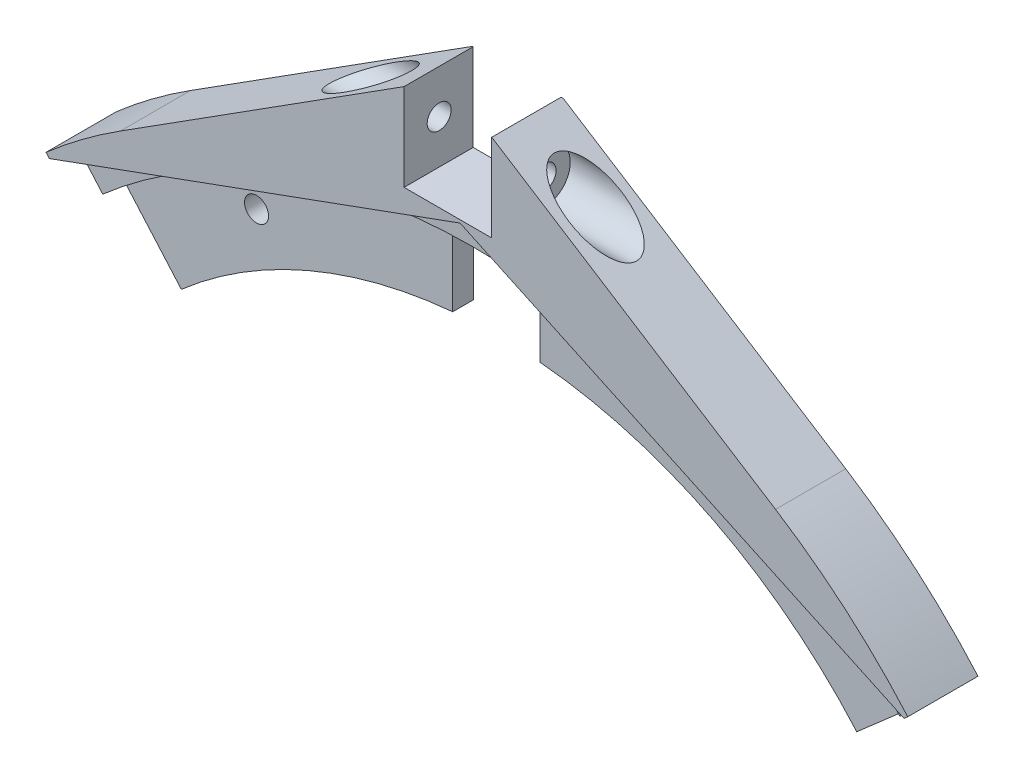
ISO-10303-21;
HEADER;
FILE_DESCRIPTION(('STEP AP214'),'2;1');
FILE_NAME('part.step','',(''),(''),'','','');
FILE_SCHEMA(('AUTOMOTIVE_DESIGN { 1 0 10303 214 1 1 1 1 }'));
ENDSEC;
DATA;
#1=APPLICATION_CONTEXT('core data for automotive mechanical design processes');
#2=APPLICATION_PROTOCOL_DEFINITION('international standard','automotive_design',2000,#1);
#3=PRODUCT_CONTEXT('',#1,'mechanical');
#4=PRODUCT('Part','Part','',(#3));
#5=PRODUCT_RELATED_PRODUCT_CATEGORY('part','',(#4));
#6=PRODUCT_DEFINITION_FORMATION('','',#4);
#7=PRODUCT_DEFINITION_CONTEXT('part definition',#1,'design');
#8=PRODUCT_DEFINITION('design','',#6,#7);
#9=PRODUCT_DEFINITION_SHAPE('','',#8);
#10=(LENGTH_UNIT() NAMED_UNIT(*) SI_UNIT(.MILLI.,.METRE.));
#11=(NAMED_UNIT(*) PLANE_ANGLE_UNIT() SI_UNIT($,.RADIAN.));
#12=(NAMED_UNIT(*) SI_UNIT($,.STERADIAN.) SOLID_ANGLE_UNIT());
#13=UNCERTAINTY_MEASURE_WITH_UNIT(LENGTH_MEASURE(1.E-05),#10,'distance_accuracy_value','');
#14=(GEOMETRIC_REPRESENTATION_CONTEXT(3) GLOBAL_UNCERTAINTY_ASSIGNED_CONTEXT((#13)) GLOBAL_UNIT_ASSIGNED_CONTEXT((#10,
#11,#12)) REPRESENTATION_CONTEXT('',''));
#15=CARTESIAN_POINT('',(0.,0.,0.));
#16=DIRECTION('',(0.,0.,1.));
#17=DIRECTION('',(1.,0.,0.));
#18=AXIS2_PLACEMENT_3D('',#15,#16,#17);
#19=CARTESIAN_POINT('',(-92.128353130934,149.5,-1.95000000000001));
#20=DIRECTION('',(1.,0.,0.));
#21=DIRECTION('',(0.,1.,0.));
#22=AXIS2_PLACEMENT_3D('',#19,#20,#21);
#23=CYLINDRICAL_SURFACE('',#22,2.75);
#24=CARTESIAN_POINT('',(10.05,149.5,-1.95000000000001));
#25=DIRECTION('',(1.,0.,0.));
#26=DIRECTION('',(0.,1.,0.));
#27=AXIS2_PLACEMENT_3D('',#24,#25,#26);
#28=CIRCLE('',#27,2.75);
#29=CARTESIAN_POINT('',(10.05,152.25,-1.95000000000001));
#30=VERTEX_POINT('',#29);
#31=EDGE_CURVE('E253',#30,#30,#28,.T.);
#32=ORIENTED_EDGE('',*,*,#31,.F.);
#33=EDGE_LOOP('',(#32));
#34=FACE_BOUND('',#33,.T.);
#35=CARTESIAN_POINT('',(14.,149.5,-1.95000000000001));
#36=DIRECTION('',(1.,0.,0.));
#37=DIRECTION('',(0.,0.,-1.));
#38=AXIS2_PLACEMENT_3D('',#35,#36,#37);
#39=CIRCLE('',#38,2.75);
#40=CARTESIAN_POINT('',(14.,149.5,-4.70000000000001));
#41=VERTEX_POINT('',#40);
#42=EDGE_CURVE('E410',#41,#41,#39,.F.);
#43=ORIENTED_EDGE('',*,*,#42,.F.);
#44=EDGE_LOOP('',(#43));
#45=FACE_BOUND('',#44,.T.);
#46=ADVANCED_FACE('F45',(#34,#45),#23,.F.);
#47=CARTESIAN_POINT('',(0.,0.,6.1));
#48=DIRECTION('',(0.,0.,-1.));
#49=DIRECTION('',(-1.,0.,0.));
#50=AXIS2_PLACEMENT_3D('',#47,#48,#49);
#51=CYLINDRICAL_SURFACE('',#50,140.);
#52=DIRECTION('',(0.,0.,-1.));
#53=VECTOR('',#52,1.);
#54=CARTESIAN_POINT('',(75.1006903670099,118.15196276998,83.1795206264264));
#55=LINE('',#54,#53);
#56=CARTESIAN_POINT('',(75.1006903670099,118.15196276998,6.09999999999999));
#57=VERTEX_POINT('',#56);
#58=CARTESIAN_POINT('',(75.1006903670099,118.15196276998,-10.));
#59=VERTEX_POINT('',#58);
#60=EDGE_CURVE('E269',#57,#59,#55,.T.);
#61=ORIENTED_EDGE('',*,*,#60,.F.);
#62=CARTESIAN_POINT('',(0.,0.,6.1));
#63=DIRECTION('',(0.,0.,1.));
#64=DIRECTION('',(1.,0.,0.));
#65=AXIS2_PLACEMENT_3D('',#62,#63,#64);
#66=CIRCLE('',#65,140.);
#67=CARTESIAN_POINT('',(105.415210237339,92.1283531309317,6.1));
#68=VERTEX_POINT('',#67);
#69=EDGE_CURVE('E377',#68,#57,#66,.T.);
#70=ORIENTED_EDGE('',*,*,#69,.F.);
#71=DIRECTION('',(0.,0.,-1.));
#72=VECTOR('',#71,1.);
#73=CARTESIAN_POINT('',(105.415210237339,92.1283531309317,6.1));
#74=LINE('',#73,#72);
#75=CARTESIAN_POINT('',(105.41521023734,92.1283531309322,-10.));
#76=VERTEX_POINT('',#75);
#77=EDGE_CURVE('E402',#68,#76,#74,.T.);
#78=ORIENTED_EDGE('',*,*,#77,.T.);
#79=CARTESIAN_POINT('',(0.,0.,-10.));
#80=DIRECTION('',(0.,0.,-1.));
#81=DIRECTION('',(-1.,0.,0.));
#82=AXIS2_PLACEMENT_3D('',#79,#80,#81);
#83=CIRCLE('',#82,140.000000000001);
#84=EDGE_CURVE('E292',#59,#76,#83,.T.);
#85=ORIENTED_EDGE('',*,*,#84,.F.);
#86=EDGE_LOOP('',(#61,#70,#78,#85));
#87=FACE_BOUND('',#86,.T.);
#88=ADVANCED_FACE('F475',(#87),#51,.T.);
#89=CARTESIAN_POINT('',(-75.1006903670099,118.15196276998,6.09999999999999));
#90=VERTEX_POINT('',#89);
#91=CARTESIAN_POINT('',(-92.1283531309338,105.415210237339,6.1));
#92=VERTEX_POINT('',#91);
#93=EDGE_CURVE('E375',#90,#92,#66,.T.);
#94=ORIENTED_EDGE('',*,*,#93,.F.);
#95=DIRECTION('',(0.,0.,-1.));
#96=VECTOR('',#95,1.);
#97=CARTESIAN_POINT('',(-75.1006903670099,118.15196276998,83.1795206264264));
#98=LINE('',#97,#96);
#99=CARTESIAN_POINT('',(-75.1006903670099,118.15196276998,-9.99999999999999));
#100=VERTEX_POINT('',#99);
#101=EDGE_CURVE('E246',#90,#100,#98,.T.);
#102=ORIENTED_EDGE('',*,*,#101,.T.);
#103=CARTESIAN_POINT('',(-92.1283531309338,105.415210237339,-10.));
#104=VERTEX_POINT('',#103);
#105=EDGE_CURVE('E288',#104,#100,#83,.T.);
#106=ORIENTED_EDGE('',*,*,#105,.F.);
#107=DIRECTION('',(0.,0.,-1.));
#108=VECTOR('',#107,1.);
#109=CARTESIAN_POINT('',(-92.1283531309338,105.415210237339,6.1));
#110=LINE('',#109,#108);
#111=EDGE_CURVE('E400',#92,#104,#110,.T.);
#112=ORIENTED_EDGE('',*,*,#111,.F.);
#113=EDGE_LOOP('',(#94,#102,#106,#112));
#114=FACE_BOUND('',#113,.T.);
#115=ADVANCED_FACE('F548',(#114),#51,.T.);
#116=CARTESIAN_POINT('',(0.,0.,-5.));
#117=DIRECTION('',(0.,0.,1.));
#118=DIRECTION('',(1.,0.,0.));
#119=AXIS2_PLACEMENT_3D('',#116,#117,#118);
#120=PLANE('',#119);
#121=DIRECTION('',(0.,-1.,0.));
#122=VECTOR('',#121,1.);
#123=CARTESIAN_POINT('',(-9.99999999999999,129.5,-5.));
#124=LINE('',#123,#122);
#125=CARTESIAN_POINT('',(-9.99999999999999,129.5,-5.));
#126=VERTEX_POINT('',#125);
#127=CARTESIAN_POINT('',(-9.99999999999999,129.113322318032,-5.));
#128=VERTEX_POINT('',#127);
#129=EDGE_CURVE('E316',#126,#128,#124,.T.);
#130=ORIENTED_EDGE('',*,*,#129,.F.);
#131=DIRECTION('',(-1.,0.,0.));
#132=VECTOR('',#131,1.);
#133=CARTESIAN_POINT('',(10.,129.5,-5.));
#134=LINE('',#133,#132);
#135=CARTESIAN_POINT('',(0.,129.5,-5.));
#136=VERTEX_POINT('',#135);
#137=EDGE_CURVE('E315',#136,#126,#134,.T.);
#138=ORIENTED_EDGE('',*,*,#137,.F.);
#139=CARTESIAN_POINT('',(0.,0.,-5.));
#140=DIRECTION('',(0.,0.,-1.));
#141=DIRECTION('',(1.,0.,0.));
#142=AXIS2_PLACEMENT_3D('',#139,#140,#141);
#143=CIRCLE('',#142,129.5);
#144=EDGE_CURVE('E342',#128,#136,#143,.T.);
#145=ORIENTED_EDGE('',*,*,#144,.F.);
#146=EDGE_LOOP('',(#130,#138,#145));
#147=FACE_BOUND('',#146,.T.);
#148=ADVANCED_FACE('F519',(#147),#120,.F.);
#149=CARTESIAN_POINT('',(10.,129.5,-5.));
#150=VERTEX_POINT('',#149);
#151=EDGE_CURVE('E310',#150,#136,#134,.T.);
#152=ORIENTED_EDGE('',*,*,#151,.F.);
#153=DIRECTION('',(0.,1.,0.));
#154=VECTOR('',#153,1.);
#155=CARTESIAN_POINT('',(10.,129.5,-5.));
#156=LINE('',#155,#154);
#157=CARTESIAN_POINT('',(10.,129.113322318032,-5.));
#158=VERTEX_POINT('',#157);
#159=EDGE_CURVE('E311',#158,#150,#156,.T.);
#160=ORIENTED_EDGE('',*,*,#159,.F.);
#161=EDGE_CURVE('E521',#136,#158,#143,.T.);
#162=ORIENTED_EDGE('',*,*,#161,.F.);
#163=EDGE_LOOP('',(#152,#160,#162));
#164=FACE_BOUND('',#163,.T.);
#165=ADVANCED_FACE('F522',(#164),#120,.F.);
#166=CARTESIAN_POINT('',(0.,0.,6.1));
#167=DIRECTION('',(-0.658059665220939,0.752965787409565,0.));
#168=DIRECTION('',(-0.752965787409565,-0.658059665220939,0.));
#169=AXIS2_PLACEMENT_3D('',#166,#167,#168);
#170=PLANE('',#169);
#171=DIRECTION('',(0.,0.,-1.));
#172=VECTOR('',#171,1.);
#173=CARTESIAN_POINT('',(104.553233239864,91.3750223636218,6.1));
#174=LINE('',#173,#172);
#175=CARTESIAN_POINT('',(104.553233239864,91.3750223636218,6.1));
#176=VERTEX_POINT('',#175);
#177=CARTESIAN_POINT('',(104.553233239864,91.3750223636218,0.));
#178=VERTEX_POINT('',#177);
#179=EDGE_CURVE('E388',#176,#178,#174,.T.);
#180=ORIENTED_EDGE('',*,*,#179,.T.);
#181=DIRECTION('',(0.752965787409465,0.658059665221053,0.));
#182=VECTOR('',#181,1.);
#183=CARTESIAN_POINT('',(105.415210237339,92.1283531309317,0.));
#184=LINE('',#183,#182);
#185=CARTESIAN_POINT('',(97.5090694695397,85.2187266461104,0.));
#186=VERTEX_POINT('',#185);
#187=EDGE_CURVE('E356',#186,#178,#184,.T.);
#188=ORIENTED_EDGE('',*,*,#187,.F.);
#189=DIRECTION('',(0.,0.,1.));
#190=VECTOR('',#189,1.);
#191=CARTESIAN_POINT('',(97.5090694695397,85.2187266461104,-5.));
#192=LINE('',#191,#190);
#193=CARTESIAN_POINT('',(97.5090694695397,85.2187266461104,-5.));
#194=VERTEX_POINT('',#193);
#195=EDGE_CURVE('E365',#194,#186,#192,.T.);
#196=ORIENTED_EDGE('',*,*,#195,.F.);
#197=DIRECTION('',(-0.752965787409565,-0.658059665220939,0.));
#198=VECTOR('',#197,1.);
#199=CARTESIAN_POINT('',(105.41521023734,92.1283531309322,-5.));
#200=LINE('',#199,#198);
#201=CARTESIAN_POINT('',(82.6191710235145,72.2055967663675,-5.));
#202=VERTEX_POINT('',#201);
#203=EDGE_CURVE('E284',#194,#202,#200,.T.);
#204=ORIENTED_EDGE('',*,*,#203,.T.);
#205=DIRECTION('',(0.,0.,1.));
#206=VECTOR('',#205,1.);
#207=CARTESIAN_POINT('',(82.6191710235145,72.2055967663675,-10.));
#208=LINE('',#207,#206);
#209=CARTESIAN_POINT('',(82.6191710235145,72.2055967663675,-10.));
#210=VERTEX_POINT('',#209);
#211=EDGE_CURVE('E334',#210,#202,#208,.T.);
#212=ORIENTED_EDGE('',*,*,#211,.F.);
#213=DIRECTION('',(-0.752965787409565,-0.658059665220939,0.));
#214=VECTOR('',#213,1.);
#215=CARTESIAN_POINT('',(105.41521023734,92.1283531309322,-10.));
#216=LINE('',#215,#214);
#217=EDGE_CURVE('E291',#76,#210,#216,.T.);
#218=ORIENTED_EDGE('',*,*,#217,.F.);
#219=ORIENTED_EDGE('',*,*,#77,.F.);
#220=DIRECTION('',(0.752965787409565,0.658059665220939,0.));
#221=VECTOR('',#220,1.);
#222=CARTESIAN_POINT('',(0.,0.,6.1));
#223=LINE('',#222,#221);
#224=EDGE_CURVE('E372',#176,#68,#223,.T.);
#225=ORIENTED_EDGE('',*,*,#224,.F.);
#226=EDGE_LOOP('',(#180,#188,#196,#204,#212,#218,#219,#225));
#227=FACE_BOUND('',#226,.T.);
#228=ADVANCED_FACE('F482',(#227),#170,.F.);
#229=CARTESIAN_POINT('',(0.,0.,6.1));
#230=DIRECTION('',(-0.752965787409557,-0.658059665220947,0.));
#231=DIRECTION('',(0.658059665220947,-0.752965787409557,0.));
#232=AXIS2_PLACEMENT_3D('',#229,#230,#231);
#233=PLANE('',#232);
#234=ORIENTED_EDGE('',*,*,#111,.T.);
#235=DIRECTION('',(-0.658059665220947,0.752965787409557,0.));
#236=VECTOR('',#235,1.);
#237=CARTESIAN_POINT('',(-92.1283531309338,105.415210237339,-10.));
#238=LINE('',#237,#236);
#239=CARTESIAN_POINT('',(-72.2055967663685,82.6191710235137,-10.));
#240=VERTEX_POINT('',#239);
#241=EDGE_CURVE('E299',#240,#104,#238,.T.);
#242=ORIENTED_EDGE('',*,*,#241,.F.);
#243=DIRECTION('',(0.,0.,1.));
#244=VECTOR('',#243,1.);
#245=CARTESIAN_POINT('',(-72.2055967663685,82.6191710235137,-10.));
#246=LINE('',#245,#244);
#247=CARTESIAN_POINT('',(-72.2055967663685,82.6191710235137,-5.));
#248=VERTEX_POINT('',#247);
#249=EDGE_CURVE('E302',#240,#248,#246,.T.);
#250=ORIENTED_EDGE('',*,*,#249,.T.);
#251=DIRECTION('',(-0.658059665220947,0.752965787409557,0.));
#252=VECTOR('',#251,1.);
#253=CARTESIAN_POINT('',(-92.1283531309338,105.415210237339,-5.));
#254=LINE('',#253,#252);
#255=CARTESIAN_POINT('',(-85.2187266461116,97.5090694695386,-5.));
#256=VERTEX_POINT('',#255);
#257=EDGE_CURVE('E321',#248,#256,#254,.T.);
#258=ORIENTED_EDGE('',*,*,#257,.T.);
#259=DIRECTION('',(0.,0.,1.));
#260=VECTOR('',#259,1.);
#261=CARTESIAN_POINT('',(-85.2187266461116,97.5090694695386,-5.));
#262=LINE('',#261,#260);
#263=CARTESIAN_POINT('',(-85.2187266461116,97.5090694695386,0.));
#264=VERTEX_POINT('',#263);
#265=EDGE_CURVE('E361',#256,#264,#262,.T.);
#266=ORIENTED_EDGE('',*,*,#265,.T.);
#267=DIRECTION('',(0.658059665221052,-0.752965787409466,0.));
#268=VECTOR('',#267,1.);
#269=CARTESIAN_POINT('',(-85.2187266461116,97.5090694695386,0.));
#270=LINE('',#269,#268);
#271=CARTESIAN_POINT('',(-91.3750223636237,104.553233239863,0.));
#272=VERTEX_POINT('',#271);
#273=EDGE_CURVE('E359',#272,#264,#270,.T.);
#274=ORIENTED_EDGE('',*,*,#273,.F.);
#275=DIRECTION('',(0.,0.,-1.));
#276=VECTOR('',#275,1.);
#277=CARTESIAN_POINT('',(-91.3750223636219,104.553233239864,6.1));
#278=LINE('',#277,#276);
#279=CARTESIAN_POINT('',(-91.3750223636219,104.553233239864,6.1));
#280=VERTEX_POINT('',#279);
#281=EDGE_CURVE('E398',#280,#272,#278,.T.);
#282=ORIENTED_EDGE('',*,*,#281,.F.);
#283=DIRECTION('',(-0.658059665220947,0.752965787409557,0.));
#284=VECTOR('',#283,1.);
#285=CARTESIAN_POINT('',(0.,0.,6.1));
#286=LINE('',#285,#284);
#287=EDGE_CURVE('E380',#280,#92,#286,.T.);
#288=ORIENTED_EDGE('',*,*,#287,.T.);
#289=EDGE_LOOP('',(#234,#242,#250,#258,#266,#274,#282,#288));
#290=FACE_BOUND('',#289,.T.);
#291=ADVANCED_FACE('F581',(#290),#233,.T.);
#292=CARTESIAN_POINT('',(-44.2916085606737,121.690194391775,6.1));
#293=DIRECTION('',(0.342020143325665,-0.939692620785909,0.));
#294=DIRECTION('',(0.93969262078591,0.342020143325665,0.));
#295=AXIS2_PLACEMENT_3D('',#292,#293,#294);
#296=PLANE('',#295);
#297=DIRECTION('',(-0.93969262078591,-0.342020143325665,0.));
#298=VECTOR('',#297,1.);
#299=CARTESIAN_POINT('',(-44.2916085606737,121.690194391775,0.));
#300=LINE('',#299,#298);
#301=CARTESIAN_POINT('',(2.79180524227468,138.827155543687,0.));
#302=VERTEX_POINT('',#301);
#303=CARTESIAN_POINT('',(-44.2916085606737,121.690194391775,0.));
#304=VERTEX_POINT('',#303);
#305=EDGE_CURVE('E389',#302,#304,#300,.T.);
#306=ORIENTED_EDGE('',*,*,#305,.F.);
#307=DIRECTION('',(0.,0.,-1.));
#308=VECTOR('',#307,1.);
#309=CARTESIAN_POINT('',(2.79180524227468,138.827155543687,6.1));
#310=LINE('',#309,#308);
#311=CARTESIAN_POINT('',(2.79180524227468,138.827155543687,6.1));
#312=VERTEX_POINT('',#311);
#313=EDGE_CURVE('E396',#312,#302,#310,.T.);
#314=ORIENTED_EDGE('',*,*,#313,.F.);
#315=DIRECTION('',(-0.93969262078591,-0.342020143325665,0.));
#316=VECTOR('',#315,1.);
#317=CARTESIAN_POINT('',(-44.2916085606737,121.690194391775,6.1));
#318=LINE('',#317,#316);
#319=EDGE_CURVE('E383',#312,#280,#318,.T.);
#320=ORIENTED_EDGE('',*,*,#319,.T.);
#321=ORIENTED_EDGE('',*,*,#281,.T.);
#322=EDGE_CURVE('E364',#304,#272,#300,.T.);
#323=ORIENTED_EDGE('',*,*,#322,.F.);
#324=EDGE_LOOP('',(#306,#314,#320,#321,#323));
#325=FACE_BOUND('',#324,.T.);
#326=ADVANCED_FACE('F555',(#325),#296,.T.);
#327=CARTESIAN_POINT('',(53.6725192410694,115.101088953654,6.1));
#328=DIRECTION('',(0.422618261740704,0.906307787036648,0.));
#329=DIRECTION('',(-0.906307787036648,0.422618261740704,0.));
#330=AXIS2_PLACEMENT_3D('',#327,#328,#329);
#331=PLANE('',#330);
#332=DIRECTION('',(0.906307787036648,-0.422618261740704,0.));
#333=VECTOR('',#332,1.);
#334=CARTESIAN_POINT('',(53.6725192410694,115.101088953654,0.));
#335=LINE('',#334,#333);
#336=CARTESIAN_POINT('',(30.7221646173225,125.803015072081,0.));
#337=VERTEX_POINT('',#336);
#338=EDGE_CURVE('E376',#302,#337,#335,.T.);
#339=ORIENTED_EDGE('',*,*,#338,.T.);
#340=DIRECTION('',(0.,0.,1.));
#341=VECTOR('',#340,1.);
#342=CARTESIAN_POINT('',(30.7221646173224,125.803015072081,-5.));
#343=LINE('',#342,#341);
#344=CARTESIAN_POINT('',(30.7221646173224,125.803015072081,-5.));
#345=VERTEX_POINT('',#344);
#346=EDGE_CURVE('E349',#345,#337,#343,.T.);
#347=ORIENTED_EDGE('',*,*,#346,.F.);
#348=DIRECTION('',(0.906307787036648,-0.422618261740703,0.));
#349=VECTOR('',#348,1.);
#350=CARTESIAN_POINT('',(30.7221646173224,125.803015072081,-5.));
#351=LINE('',#350,#349);
#352=CARTESIAN_POINT('',(76.6228738648162,104.399162835228,-5.));
#353=VERTEX_POINT('',#352);
#354=EDGE_CURVE('E341',#345,#353,#351,.T.);
#355=ORIENTED_EDGE('',*,*,#354,.T.);
#356=DIRECTION('',(0.,0.,1.));
#357=VECTOR('',#356,1.);
#358=CARTESIAN_POINT('',(76.6228738648162,104.399162835228,-5.));
#359=LINE('',#358,#357);
#360=CARTESIAN_POINT('',(76.6228738648162,104.399162835228,0.));
#361=VERTEX_POINT('',#360);
#362=EDGE_CURVE('E367',#353,#361,#359,.T.);
#363=ORIENTED_EDGE('',*,*,#362,.T.);
#364=EDGE_CURVE('E392',#361,#178,#335,.T.);
#365=ORIENTED_EDGE('',*,*,#364,.T.);
#366=ORIENTED_EDGE('',*,*,#179,.F.);
#367=DIRECTION('',(0.906307787036648,-0.422618261740704,0.));
#368=VECTOR('',#367,1.);
#369=CARTESIAN_POINT('',(53.6725192410694,115.101088953654,6.1));
#370=LINE('',#369,#368);
#371=EDGE_CURVE('E386',#312,#176,#370,.T.);
#372=ORIENTED_EDGE('',*,*,#371,.F.);
#373=ORIENTED_EDGE('',*,*,#313,.T.);
#374=EDGE_LOOP('',(#339,#347,#355,#363,#365,#366,#372,#373));
#375=FACE_BOUND('',#374,.T.);
#376=ADVANCED_FACE('F561',(#375),#331,.F.);
#377=CARTESIAN_POINT('',(0.,0.,6.1));
#378=DIRECTION('',(0.,0.,1.));
#379=DIRECTION('',(1.,0.,0.));
#380=AXIS2_PLACEMENT_3D('',#377,#378,#379);
#381=PLANE('',#380);
#382=DIRECTION('',(1.,0.,0.));
#383=VECTOR('',#382,1.);
#384=CARTESIAN_POINT('',(-10.05,139.5,6.1));
#385=LINE('',#384,#383);
#386=CARTESIAN_POINT('',(-10.05,139.5,6.1));
#387=VERTEX_POINT('',#386);
#388=CARTESIAN_POINT('',(10.05,139.5,6.1));
#389=VERTEX_POINT('',#388);
#390=EDGE_CURVE('E229',#387,#389,#385,.T.);
#391=ORIENTED_EDGE('',*,*,#390,.F.);
#392=DIRECTION('',(0.,1.,0.));
#393=VECTOR('',#392,1.);
#394=CARTESIAN_POINT('',(-10.05,139.638810865749,6.09999999999999));
#395=LINE('',#394,#393);
#396=CARTESIAN_POINT('',(-10.05,159.5,6.09999999999999));
#397=VERTEX_POINT('',#396);
#398=EDGE_CURVE('E238',#387,#397,#395,.T.);
#399=ORIENTED_EDGE('',*,*,#398,.T.);
#400=DIRECTION('',(-0.843942591214139,-0.536433502621495,0.));
#401=VECTOR('',#400,1.);
#402=CARTESIAN_POINT('',(-10.05,159.5,6.09999999999999));
#403=LINE('',#402,#401);
#404=EDGE_CURVE('E245',#397,#90,#403,.T.);
#405=ORIENTED_EDGE('',*,*,#404,.T.);
#406=ORIENTED_EDGE('',*,*,#93,.T.);
#407=ORIENTED_EDGE('',*,*,#287,.F.);
#408=ORIENTED_EDGE('',*,*,#319,.F.);
#409=ORIENTED_EDGE('',*,*,#371,.T.);
#410=ORIENTED_EDGE('',*,*,#224,.T.);
#411=ORIENTED_EDGE('',*,*,#69,.T.);
#412=DIRECTION('',(-0.843942591214139,0.536433502621495,0.));
#413=VECTOR('',#412,1.);
#414=CARTESIAN_POINT('',(10.05,159.5,6.09999999999999));
#415=LINE('',#414,#413);
#416=CARTESIAN_POINT('',(10.05,159.5,6.09999999999999));
#417=VERTEX_POINT('',#416);
#418=EDGE_CURVE('E270',#57,#417,#415,.T.);
#419=ORIENTED_EDGE('',*,*,#418,.T.);
#420=DIRECTION('',(0.,-1.,0.));
#421=VECTOR('',#420,1.);
#422=CARTESIAN_POINT('',(10.05,139.638810865749,6.09999999999999));
#423=LINE('',#422,#421);
#424=EDGE_CURVE('E252',#417,#389,#423,.T.);
#425=ORIENTED_EDGE('',*,*,#424,.T.);
#426=EDGE_LOOP('',(#391,#399,#405,#406,#407,#408,#409,#410,#411,#419,#425));
#427=FACE_BOUND('',#426,.T.);
#428=ADVANCED_FACE('F249',(#427),#381,.T.);
#429=CARTESIAN_POINT('',(0.,0.,0.));
#430=DIRECTION('',(0.,0.,1.));
#431=DIRECTION('',(1.,0.,0.));
#432=AXIS2_PLACEMENT_3D('',#429,#430,#431);
#433=PLANE('',#432);
#434=ORIENTED_EDGE('',*,*,#364,.F.);
#435=CARTESIAN_POINT('',(0.,0.,0.));
#436=DIRECTION('',(0.,0.,-1.));
#437=DIRECTION('',(1.,0.,0.));
#438=AXIS2_PLACEMENT_3D('',#435,#436,#437);
#439=CIRCLE('',#438,129.5);
#440=EDGE_CURVE('E353',#361,#186,#439,.T.);
#441=ORIENTED_EDGE('',*,*,#440,.T.);
#442=ORIENTED_EDGE('',*,*,#187,.T.);
#443=EDGE_LOOP('',(#434,#441,#442));
#444=FACE_BOUND('',#443,.T.);
#445=ADVANCED_FACE('F565',(#444),#433,.T.);
#446=ORIENTED_EDGE('',*,*,#338,.F.);
#447=ORIENTED_EDGE('',*,*,#305,.T.);
#448=CARTESIAN_POINT('',(0.,0.,0.));
#449=DIRECTION('',(0.,0.,-1.));
#450=DIRECTION('',(1.,0.,0.));
#451=AXIS2_PLACEMENT_3D('',#448,#449,#450);
#452=CIRCLE('',#451,129.5);
#453=EDGE_CURVE('E337',#304,#337,#452,.T.);
#454=ORIENTED_EDGE('',*,*,#453,.T.);
#455=EDGE_LOOP('',(#446,#447,#454));
#456=FACE_BOUND('',#455,.T.);
#457=ADVANCED_FACE('F577',(#456),#433,.T.);
#458=CARTESIAN_POINT('',(0.,0.,-5.));
#459=DIRECTION('',(0.,0.,1.));
#460=DIRECTION('',(1.,0.,0.));
#461=AXIS2_PLACEMENT_3D('',#458,#459,#460);
#462=CYLINDRICAL_SURFACE('',#461,129.5);
#463=EDGE_CURVE('E350',#264,#304,#452,.T.);
#464=ORIENTED_EDGE('',*,*,#463,.F.);
#465=ORIENTED_EDGE('',*,*,#265,.F.);
#466=EDGE_CURVE('E338',#256,#128,#143,.T.);
#467=ORIENTED_EDGE('',*,*,#466,.T.);
#468=ORIENTED_EDGE('',*,*,#144,.T.);
#469=ORIENTED_EDGE('',*,*,#161,.T.);
#470=EDGE_CURVE('E343',#158,#345,#143,.T.);
#471=ORIENTED_EDGE('',*,*,#470,.T.);
#472=ORIENTED_EDGE('',*,*,#346,.T.);
#473=ORIENTED_EDGE('',*,*,#453,.F.);
#474=EDGE_LOOP('',(#464,#465,#467,#468,#469,#471,#472,#473));
#475=FACE_BOUND('',#474,.T.);
#476=ADVANCED_FACE('F526',(#475),#462,.F.);
#477=CARTESIAN_POINT('',(0.,0.,-5.));
#478=DIRECTION('',(0.,0.,1.));
#479=DIRECTION('',(1.,0.,0.));
#480=AXIS2_PLACEMENT_3D('',#477,#478,#479);
#481=CYLINDRICAL_SURFACE('',#480,129.5);
#482=ORIENTED_EDGE('',*,*,#440,.F.);
#483=ORIENTED_EDGE('',*,*,#362,.F.);
#484=CARTESIAN_POINT('',(0.,0.,-5.));
#485=DIRECTION('',(0.,0.,-1.));
#486=DIRECTION('',(1.,0.,0.));
#487=AXIS2_PLACEMENT_3D('',#484,#485,#486);
#488=CIRCLE('',#487,129.5);
#489=EDGE_CURVE('E346',#353,#194,#488,.T.);
#490=ORIENTED_EDGE('',*,*,#489,.T.);
#491=ORIENTED_EDGE('',*,*,#195,.T.);
#492=EDGE_LOOP('',(#482,#483,#490,#491));
#493=FACE_BOUND('',#492,.T.);
#494=ADVANCED_FACE('F568',(#493),#481,.F.);
#495=ORIENTED_EDGE('',*,*,#463,.T.);
#496=ORIENTED_EDGE('',*,*,#322,.T.);
#497=ORIENTED_EDGE('',*,*,#273,.T.);
#498=EDGE_LOOP('',(#495,#496,#497));
#499=FACE_BOUND('',#498,.T.);
#500=ADVANCED_FACE('F579',(#499),#433,.T.);
#501=CARTESIAN_POINT('',(0.,0.,-5.));
#502=DIRECTION('',(0.,0.,-1.));
#503=DIRECTION('',(-1.,0.,0.));
#504=AXIS2_PLACEMENT_3D('',#501,#502,#503);
#505=PLANE('',#504);
#506=ORIENTED_EDGE('',*,*,#466,.F.);
#507=ORIENTED_EDGE('',*,*,#257,.F.);
#508=CARTESIAN_POINT('',(0.,0.,-5.));
#509=DIRECTION('',(0.,0.,1.));
#510=DIRECTION('',(-1.,0.,0.));
#511=AXIS2_PLACEMENT_3D('',#508,#509,#510);
#512=CIRCLE('',#511,109.725);
#513=CARTESIAN_POINT('',(-9.99999999999999,109.268365161194,-5.));
#514=VERTEX_POINT('',#513);
#515=EDGE_CURVE('E319',#514,#248,#512,.T.);
#516=ORIENTED_EDGE('',*,*,#515,.F.);
#517=EDGE_CURVE('E314',#128,#514,#124,.T.);
#518=ORIENTED_EDGE('',*,*,#517,.F.);
#519=EDGE_LOOP('',(#506,#507,#516,#518));
#520=FACE_BOUND('',#519,.T.);
#521=CARTESIAN_POINT('',(-54.9667964392054,107.162966034031,-5.));
#522=DIRECTION('',(0.,0.,-1.));
#523=DIRECTION('',(-1.,0.,0.));
#524=AXIS2_PLACEMENT_3D('',#521,#522,#523);
#525=CIRCLE('',#524,2.75);
#526=CARTESIAN_POINT('',(-57.7167964392054,107.162966034031,-5.));
#527=VERTEX_POINT('',#526);
#528=EDGE_CURVE('E285',#527,#527,#525,.T.);
#529=ORIENTED_EDGE('',*,*,#528,.T.);
#530=EDGE_LOOP('',(#529));
#531=FACE_BOUND('',#530,.T.);
#532=ADVANCED_FACE('F533',(#520,#531),#505,.F.);
#533=CARTESIAN_POINT('',(0.,0.,-10.));
#534=DIRECTION('',(0.,0.,-1.));
#535=DIRECTION('',(-1.,0.,0.));
#536=AXIS2_PLACEMENT_3D('',#533,#534,#535);
#537=PLANE('',#536);
#538=CARTESIAN_POINT('',(0.,0.,-10.));
#539=DIRECTION('',(0.,0.,1.));
#540=DIRECTION('',(-1.,0.,0.));
#541=AXIS2_PLACEMENT_3D('',#538,#539,#540);
#542=CIRCLE('',#541,109.725);
#543=CARTESIAN_POINT('',(10.25,109.245197262855,-10.));
#544=VERTEX_POINT('',#543);
#545=EDGE_CURVE('E294',#210,#544,#542,.T.);
#546=ORIENTED_EDGE('',*,*,#545,.T.);
#547=DIRECTION('',(0.,1.,0.));
#548=VECTOR('',#547,1.);
#549=CARTESIAN_POINT('',(10.25,129.5,-10.));
#550=LINE('',#549,#548);
#551=CARTESIAN_POINT('',(10.25,129.75,-10.));
#552=VERTEX_POINT('',#551);
#553=EDGE_CURVE('E433',#544,#552,#550,.T.);
#554=ORIENTED_EDGE('',*,*,#553,.T.);
#555=DIRECTION('',(-1.,0.,0.));
#556=VECTOR('',#555,1.);
#557=CARTESIAN_POINT('',(-9.99999999999999,129.75,-10.));
#558=LINE('',#557,#556);
#559=CARTESIAN_POINT('',(-10.25,129.75,-10.));
#560=VERTEX_POINT('',#559);
#561=EDGE_CURVE('E429',#552,#560,#558,.T.);
#562=ORIENTED_EDGE('',*,*,#561,.T.);
#563=DIRECTION('',(0.,-1.,0.));
#564=VECTOR('',#563,1.);
#565=CARTESIAN_POINT('',(-10.25,109.268365161194,-10.));
#566=LINE('',#565,#564);
#567=CARTESIAN_POINT('',(-10.25,109.245197262855,-10.));
#568=VERTEX_POINT('',#567);
#569=EDGE_CURVE('E431',#560,#568,#566,.T.);
#570=ORIENTED_EDGE('',*,*,#569,.T.);
#571=CARTESIAN_POINT('',(0.,0.,-10.));
#572=DIRECTION('',(0.,0.,1.));
#573=DIRECTION('',(-1.,0.,0.));
#574=AXIS2_PLACEMENT_3D('',#571,#572,#573);
#575=CIRCLE('',#574,109.725);
#576=EDGE_CURVE('E297',#568,#240,#575,.T.);
#577=ORIENTED_EDGE('',*,*,#576,.T.);
#578=ORIENTED_EDGE('',*,*,#241,.T.);
#579=ORIENTED_EDGE('',*,*,#105,.T.);
#580=DIRECTION('',(-0.843942591214139,-0.536433502621495,0.));
#581=VECTOR('',#580,1.);
#582=CARTESIAN_POINT('',(-10.05,159.5,-9.99999999999999));
#583=LINE('',#582,#581);
#584=CARTESIAN_POINT('',(-10.3,159.341093011478,-9.99999999999999));
#585=VERTEX_POINT('',#584);
#586=EDGE_CURVE('E260',#585,#100,#583,.T.);
#587=ORIENTED_EDGE('',*,*,#586,.F.);
#588=DIRECTION('',(0.,-1.,0.));
#589=VECTOR('',#588,1.);
#590=CARTESIAN_POINT('',(-10.3,139.5,-10.));
#591=LINE('',#590,#589);
#592=CARTESIAN_POINT('',(-10.3,139.25,-10.));
#593=VERTEX_POINT('',#592);
#594=EDGE_CURVE('E427',#585,#593,#591,.T.);
#595=ORIENTED_EDGE('',*,*,#594,.T.);
#596=DIRECTION('',(1.,0.,0.));
#597=VECTOR('',#596,1.);
#598=CARTESIAN_POINT('',(10.05,139.25,-10.));
#599=LINE('',#598,#597);
#600=CARTESIAN_POINT('',(10.3000000000001,139.25,-10.));
#601=VERTEX_POINT('',#600);
#602=EDGE_CURVE('E425',#593,#601,#599,.T.);
#603=ORIENTED_EDGE('',*,*,#602,.T.);
#604=DIRECTION('',(0.,1.,0.));
#605=VECTOR('',#604,1.);
#606=CARTESIAN_POINT('',(10.3000000000001,159.5,-10.));
#607=LINE('',#606,#605);
#608=CARTESIAN_POINT('',(10.3000000000001,159.341093011478,-9.99999999999999));
#609=VERTEX_POINT('',#608);
#610=EDGE_CURVE('E423',#601,#609,#607,.T.);
#611=ORIENTED_EDGE('',*,*,#610,.T.);
#612=DIRECTION('',(-0.843942591214139,0.536433502621495,0.));
#613=VECTOR('',#612,1.);
#614=CARTESIAN_POINT('',(10.05,159.5,-9.99999999999999));
#615=LINE('',#614,#613);
#616=EDGE_CURVE('E263',#59,#609,#615,.T.);
#617=ORIENTED_EDGE('',*,*,#616,.F.);
#618=ORIENTED_EDGE('',*,*,#84,.T.);
#619=ORIENTED_EDGE('',*,*,#217,.T.);
#620=EDGE_LOOP('',(#546,#554,#562,#570,#577,#578,#579,#587,#595,#603,#611,#617,#618,#619));
#621=FACE_BOUND('',#620,.T.);
#622=CARTESIAN_POINT('',(76.8131193575413,91.542310952718,-10.));
#623=DIRECTION('',(0.,0.,1.));
#624=DIRECTION('',(1.,0.,0.));
#625=AXIS2_PLACEMENT_3D('',#622,#623,#624);
#626=CIRCLE('',#625,2.75000000000001);
#627=CARTESIAN_POINT('',(79.5631193575413,91.542310952718,-10.));
#628=VERTEX_POINT('',#627);
#629=EDGE_CURVE('E272',#628,#628,#626,.T.);
#630=ORIENTED_EDGE('',*,*,#629,.T.);
#631=EDGE_LOOP('',(#630));
#632=FACE_BOUND('',#631,.T.);
#633=CARTESIAN_POINT('',(-54.9667964392054,107.162966034031,-10.));
#634=DIRECTION('',(0.,0.,-1.));
#635=DIRECTION('',(-1.,0.,0.));
#636=AXIS2_PLACEMENT_3D('',#633,#634,#635);
#637=CIRCLE('',#636,2.75);
#638=CARTESIAN_POINT('',(-57.7167964392054,107.162966034031,-10.));
#639=VERTEX_POINT('',#638);
#640=EDGE_CURVE('E281',#639,#639,#637,.T.);
#641=ORIENTED_EDGE('',*,*,#640,.F.);
#642=EDGE_LOOP('',(#641));
#643=FACE_BOUND('',#642,.T.);
#644=ADVANCED_FACE('F469',(#621,#632,#643),#537,.T.);
#645=CARTESIAN_POINT('',(76.8131193575413,91.542310952718,-5.));
#646=DIRECTION('',(0.,0.,-1.));
#647=DIRECTION('',(-1.,0.,0.));
#648=AXIS2_PLACEMENT_3D('',#645,#646,#647);
#649=CIRCLE('',#648,2.75000000000001);
#650=CARTESIAN_POINT('',(74.0631193575413,91.542310952718,-5.));
#651=VERTEX_POINT('',#650);
#652=EDGE_CURVE('E280',#651,#651,#649,.T.);
#653=ORIENTED_EDGE('',*,*,#652,.T.);
#654=EDGE_LOOP('',(#653));
#655=FACE_BOUND('',#654,.T.);
#656=ORIENTED_EDGE('',*,*,#470,.F.);
#657=CARTESIAN_POINT('',(10.,109.268365161194,-5.));
#658=VERTEX_POINT('',#657);
#659=EDGE_CURVE('E307',#658,#158,#156,.T.);
#660=ORIENTED_EDGE('',*,*,#659,.F.);
#661=CARTESIAN_POINT('',(0.,0.,-5.));
#662=DIRECTION('',(0.,0.,1.));
#663=DIRECTION('',(-1.,0.,0.));
#664=AXIS2_PLACEMENT_3D('',#661,#662,#663);
#665=CIRCLE('',#664,109.725);
#666=EDGE_CURVE('E304',#202,#658,#665,.T.);
#667=ORIENTED_EDGE('',*,*,#666,.F.);
#668=ORIENTED_EDGE('',*,*,#203,.F.);
#669=ORIENTED_EDGE('',*,*,#489,.F.);
#670=ORIENTED_EDGE('',*,*,#354,.F.);
#671=EDGE_LOOP('',(#656,#660,#667,#668,#669,#670));
#672=FACE_BOUND('',#671,.T.);
#673=ADVANCED_FACE('F572',(#655,#672),#505,.F.);
#674=CARTESIAN_POINT('',(0.,0.,-10.));
#675=DIRECTION('',(0.,0.,1.));
#676=DIRECTION('',(1.,0.,0.));
#677=AXIS2_PLACEMENT_3D('',#674,#675,#676);
#678=CYLINDRICAL_SURFACE('',#677,109.725);
#679=DIRECTION('',(0.,0.,1.));
#680=VECTOR('',#679,1.);
#681=CARTESIAN_POINT('',(10.,109.268365161194,-10.));
#682=LINE('',#681,#680);
#683=CARTESIAN_POINT('',(10.,109.268365161194,-9.75));
#684=VERTEX_POINT('',#683);
#685=EDGE_CURVE('E332',#684,#658,#682,.T.);
#686=ORIENTED_EDGE('',*,*,#685,.F.);
#687=CARTESIAN_POINT('',(0.,0.,0.250000000000011));
#688=DIRECTION('',(-0.707106781186547,0.,-0.707106781186547));
#689=DIRECTION('',(-0.707106781186548,0.,0.707106781186548));
#690=AXIS2_PLACEMENT_3D('',#687,#688,#689);
#691=ELLIPSE('',#690,155.174583131388,109.725);
#692=EDGE_CURVE('E438',#684,#544,#691,.T.);
#693=ORIENTED_EDGE('',*,*,#692,.T.);
#694=ORIENTED_EDGE('',*,*,#545,.F.);
#695=ORIENTED_EDGE('',*,*,#211,.T.);
#696=ORIENTED_EDGE('',*,*,#666,.T.);
#697=EDGE_LOOP('',(#686,#693,#694,#695,#696));
#698=FACE_BOUND('',#697,.T.);
#699=ADVANCED_FACE('F487',(#698),#678,.F.);
#700=CARTESIAN_POINT('',(10.,129.5,-10.));
#701=DIRECTION('',(1.,0.,0.));
#702=DIRECTION('',(0.,0.,-1.));
#703=AXIS2_PLACEMENT_3D('',#700,#701,#702);
#704=PLANE('',#703);
#705=DIRECTION('',(0.,0.,1.));
#706=VECTOR('',#705,1.);
#707=CARTESIAN_POINT('',(10.,129.5,-10.));
#708=LINE('',#707,#706);
#709=CARTESIAN_POINT('',(10.,129.5,-9.75));
#710=VERTEX_POINT('',#709);
#711=EDGE_CURVE('E330',#710,#150,#708,.T.);
#712=ORIENTED_EDGE('',*,*,#711,.F.);
#713=DIRECTION('',(0.,-1.,0.));
#714=VECTOR('',#713,1.);
#715=CARTESIAN_POINT('',(10.,109.268365161194,-9.75));
#716=LINE('',#715,#714);
#717=EDGE_CURVE('E436',#710,#684,#716,.T.);
#718=ORIENTED_EDGE('',*,*,#717,.T.);
#719=ORIENTED_EDGE('',*,*,#685,.T.);
#720=ORIENTED_EDGE('',*,*,#659,.T.);
#721=ORIENTED_EDGE('',*,*,#159,.T.);
#722=EDGE_LOOP('',(#712,#718,#719,#720,#721));
#723=FACE_BOUND('',#722,.T.);
#724=ADVANCED_FACE('F512',(#723),#704,.F.);
#725=CARTESIAN_POINT('',(10.,129.5,-10.));
#726=DIRECTION('',(0.,1.,0.));
#727=DIRECTION('',(0.,0.,1.));
#728=AXIS2_PLACEMENT_3D('',#725,#726,#727);
#729=PLANE('',#728);
#730=DIRECTION('',(0.,0.,1.));
#731=VECTOR('',#730,1.);
#732=CARTESIAN_POINT('',(-9.99999999999999,129.5,-10.));
#733=LINE('',#732,#731);
#734=CARTESIAN_POINT('',(-9.99999999999999,129.5,-9.75));
#735=VERTEX_POINT('',#734);
#736=EDGE_CURVE('E328',#735,#126,#733,.T.);
#737=ORIENTED_EDGE('',*,*,#736,.F.);
#738=DIRECTION('',(1.,0.,0.));
#739=VECTOR('',#738,1.);
#740=CARTESIAN_POINT('',(10.,129.5,-9.75));
#741=LINE('',#740,#739);
#742=EDGE_CURVE('E444',#735,#710,#741,.T.);
#743=ORIENTED_EDGE('',*,*,#742,.T.);
#744=ORIENTED_EDGE('',*,*,#711,.T.);
#745=ORIENTED_EDGE('',*,*,#151,.T.);
#746=ORIENTED_EDGE('',*,*,#137,.T.);
#747=EDGE_LOOP('',(#737,#743,#744,#745,#746));
#748=FACE_BOUND('',#747,.T.);
#749=ADVANCED_FACE('F507',(#748),#729,.F.);
#750=CARTESIAN_POINT('',(-9.99999999999999,129.5,-10.));
#751=DIRECTION('',(-1.,0.,0.));
#752=DIRECTION('',(0.,0.,1.));
#753=AXIS2_PLACEMENT_3D('',#750,#751,#752);
#754=PLANE('',#753);
#755=DIRECTION('',(0.,0.,1.));
#756=VECTOR('',#755,1.);
#757=CARTESIAN_POINT('',(-9.99999999999999,109.268365161194,-10.));
#758=LINE('',#757,#756);
#759=CARTESIAN_POINT('',(-9.99999999999999,109.268365161194,-9.75));
#760=VERTEX_POINT('',#759);
#761=EDGE_CURVE('E326',#760,#514,#758,.T.);
#762=ORIENTED_EDGE('',*,*,#761,.F.);
#763=DIRECTION('',(0.,1.,0.));
#764=VECTOR('',#763,1.);
#765=CARTESIAN_POINT('',(-9.99999999999999,129.5,-9.75));
#766=LINE('',#765,#764);
#767=EDGE_CURVE('E442',#760,#735,#766,.T.);
#768=ORIENTED_EDGE('',*,*,#767,.T.);
#769=ORIENTED_EDGE('',*,*,#736,.T.);
#770=ORIENTED_EDGE('',*,*,#129,.T.);
#771=ORIENTED_EDGE('',*,*,#517,.T.);
#772=EDGE_LOOP('',(#762,#768,#769,#770,#771));
#773=FACE_BOUND('',#772,.T.);
#774=ADVANCED_FACE('F537',(#773),#754,.F.);
#775=CARTESIAN_POINT('',(0.,0.,-10.));
#776=DIRECTION('',(0.,0.,1.));
#777=DIRECTION('',(1.,0.,0.));
#778=AXIS2_PLACEMENT_3D('',#775,#776,#777);
#779=CYLINDRICAL_SURFACE('',#778,109.725);
#780=ORIENTED_EDGE('',*,*,#576,.F.);
#781=CARTESIAN_POINT('',(0.,0.,0.249999999999988));
#782=DIRECTION('',(0.707106781186547,0.,-0.707106781186547));
#783=DIRECTION('',(0.707106781186548,0.,0.707106781186548));
#784=AXIS2_PLACEMENT_3D('',#781,#782,#783);
#785=ELLIPSE('',#784,155.174583131388,109.725);
#786=EDGE_CURVE('E440',#568,#760,#785,.T.);
#787=ORIENTED_EDGE('',*,*,#786,.T.);
#788=ORIENTED_EDGE('',*,*,#761,.T.);
#789=ORIENTED_EDGE('',*,*,#515,.T.);
#790=ORIENTED_EDGE('',*,*,#249,.F.);
#791=EDGE_LOOP('',(#780,#787,#788,#789,#790));
#792=FACE_BOUND('',#791,.T.);
#793=ADVANCED_FACE('F539',(#792),#779,.F.);
#794=CARTESIAN_POINT('',(-54.9667964392054,107.162966034031,-10.));
#795=DIRECTION('',(0.,0.,1.));
#796=DIRECTION('',(1.,0.,0.));
#797=AXIS2_PLACEMENT_3D('',#794,#795,#796);
#798=CYLINDRICAL_SURFACE('',#797,2.75);
#799=ORIENTED_EDGE('',*,*,#640,.T.);
#800=EDGE_LOOP('',(#799));
#801=FACE_BOUND('',#800,.T.);
#802=ORIENTED_EDGE('',*,*,#528,.F.);
#803=EDGE_LOOP('',(#802));
#804=FACE_BOUND('',#803,.T.);
#805=ADVANCED_FACE('F633',(#801,#804),#798,.F.);
#806=CARTESIAN_POINT('',(76.8131193575413,91.542310952718,-10.));
#807=DIRECTION('',(0.,0.,1.));
#808=DIRECTION('',(1.,0.,0.));
#809=AXIS2_PLACEMENT_3D('',#806,#807,#808);
#810=CYLINDRICAL_SURFACE('',#809,2.75000000000001);
#811=ORIENTED_EDGE('',*,*,#629,.F.);
#812=EDGE_LOOP('',(#811));
#813=FACE_BOUND('',#812,.T.);
#814=ORIENTED_EDGE('',*,*,#652,.F.);
#815=EDGE_LOOP('',(#814));
#816=FACE_BOUND('',#815,.T.);
#817=ADVANCED_FACE('F629',(#813,#816),#810,.F.);
#818=CARTESIAN_POINT('',(10.05,159.5,83.1795206264264));
#819=DIRECTION('',(-0.536433502621495,-0.843942591214139,0.));
#820=DIRECTION('',(0.843942591214139,-0.536433502621495,0.));
#821=AXIS2_PLACEMENT_3D('',#818,#819,#820);
#822=PLANE('',#821);
#823=CARTESIAN_POINT('',(25.7824735888022,149.5,-1.95000000000001));
#824=DIRECTION('',(-0.536433502621495,-0.843942591214139,0.));
#825=DIRECTION('',(-0.843942591214139,0.536433502621495,0.));
#826=AXIS2_PLACEMENT_3D('',#823,#824,#825);
#827=ELLIPSE('',#826,11.1849837317741,6.);
#828=CARTESIAN_POINT('',(16.3429894355208,155.5,-1.95000000000001));
#829=VERTEX_POINT('',#828);
#830=EDGE_CURVE('E409',#829,#829,#827,.F.);
#831=ORIENTED_EDGE('',*,*,#830,.F.);
#832=EDGE_LOOP('',(#831));
#833=FACE_BOUND('',#832,.T.);
#834=ORIENTED_EDGE('',*,*,#616,.T.);
#835=DIRECTION('',(-0.644956910153914,0.4099526412763,0.644956910153927));
#836=VECTOR('',#835,1.);
#837=CARTESIAN_POINT('',(15.3013339353275,156.162105354453,-15.0013339353275));
#838=LINE('',#837,#836);
#839=CARTESIAN_POINT('',(10.05,159.5,-9.74999999999997));
#840=VERTEX_POINT('',#839);
#841=EDGE_CURVE('E11',#609,#840,#838,.T.);
#842=ORIENTED_EDGE('',*,*,#841,.T.);
#843=DIRECTION('',(0.,0.,-1.));
#844=VECTOR('',#843,1.);
#845=CARTESIAN_POINT('',(10.05,159.5,83.1795206264264));
#846=LINE('',#845,#844);
#847=EDGE_CURVE('E274',#417,#840,#846,.T.);
#848=ORIENTED_EDGE('',*,*,#847,.F.);
#849=ORIENTED_EDGE('',*,*,#418,.F.);
#850=ORIENTED_EDGE('',*,*,#60,.T.);
#851=EDGE_LOOP('',(#834,#842,#848,#849,#850));
#852=FACE_BOUND('',#851,.T.);
#853=ADVANCED_FACE('F471',(#833,#852),#822,.F.);
#854=CARTESIAN_POINT('',(10.05,139.638810865749,83.1795206264264));
#855=DIRECTION('',(1.,0.,0.));
#856=DIRECTION('',(0.,1.,0.));
#857=AXIS2_PLACEMENT_3D('',#854,#855,#856);
#858=PLANE('',#857);
#859=ORIENTED_EDGE('',*,*,#31,.T.);
#860=EDGE_LOOP('',(#859));
#861=FACE_BOUND('',#860,.T.);
#862=ORIENTED_EDGE('',*,*,#847,.T.);
#863=DIRECTION('',(0.,-1.,0.));
#864=VECTOR('',#863,1.);
#865=CARTESIAN_POINT('',(10.05,139.5,-9.74999999999997));
#866=LINE('',#865,#864);
#867=CARTESIAN_POINT('',(10.05,139.5,-9.74999999999997));
#868=VERTEX_POINT('',#867);
#869=EDGE_CURVE('E55',#840,#868,#866,.T.);
#870=ORIENTED_EDGE('',*,*,#869,.T.);
#871=DIRECTION('',(0.,0.,1.));
#872=VECTOR('',#871,1.);
#873=CARTESIAN_POINT('',(10.05,139.5,-10.));
#874=LINE('',#873,#872);
#875=EDGE_CURVE('E235',#868,#389,#874,.T.);
#876=ORIENTED_EDGE('',*,*,#875,.T.);
#877=ORIENTED_EDGE('',*,*,#424,.F.);
#878=EDGE_LOOP('',(#862,#870,#876,#877));
#879=FACE_BOUND('',#878,.T.);
#880=ADVANCED_FACE('F620',(#861,#879),#858,.F.);
#881=CARTESIAN_POINT('',(-10.05,159.5,83.1795206264264));
#882=DIRECTION('',(0.536433502621495,-0.843942591214138,0.));
#883=DIRECTION('',(0.843942591214139,0.536433502621495,0.));
#884=AXIS2_PLACEMENT_3D('',#881,#882,#883);
#885=PLANE('',#884);
#886=CARTESIAN_POINT('',(-25.7824735888022,149.5,-1.95000000000001));
#887=DIRECTION('',(0.536433502621495,-0.843942591214138,0.));
#888=DIRECTION('',(0.843942591214139,0.536433502621495,0.));
#889=AXIS2_PLACEMENT_3D('',#886,#887,#888);
#890=ELLIPSE('',#889,11.1849837317741,6.00000000000003);
#891=CARTESIAN_POINT('',(-16.3429894355208,155.5,-1.95000000000001));
#892=VERTEX_POINT('',#891);
#893=EDGE_CURVE('E419',#892,#892,#890,.T.);
#894=ORIENTED_EDGE('',*,*,#893,.T.);
#895=EDGE_LOOP('',(#894));
#896=FACE_BOUND('',#895,.T.);
#897=DIRECTION('',(0.,0.,-1.));
#898=VECTOR('',#897,1.);
#899=CARTESIAN_POINT('',(-10.05,159.5,83.1795206264264));
#900=LINE('',#899,#898);
#901=CARTESIAN_POINT('',(-10.05,159.5,-9.74999999999997));
#902=VERTEX_POINT('',#901);
#903=EDGE_CURVE('E241',#397,#902,#900,.T.);
#904=ORIENTED_EDGE('',*,*,#903,.T.);
#905=DIRECTION('',(-0.644956910153915,-0.409952641276301,-0.644956910153926));
#906=VECTOR('',#905,1.);
#907=CARTESIAN_POINT('',(-15.3013339353274,156.162105354453,-15.0013339353275));
#908=LINE('',#907,#906);
#909=EDGE_CURVE('E448',#902,#585,#908,.T.);
#910=ORIENTED_EDGE('',*,*,#909,.T.);
#911=ORIENTED_EDGE('',*,*,#586,.T.);
#912=ORIENTED_EDGE('',*,*,#101,.F.);
#913=ORIENTED_EDGE('',*,*,#404,.F.);
#914=EDGE_LOOP('',(#904,#910,#911,#912,#913));
#915=FACE_BOUND('',#914,.T.);
#916=ADVANCED_FACE('F550',(#896,#915),#885,.F.);
#917=CARTESIAN_POINT('',(-10.05,139.638810865749,83.1795206264264));
#918=DIRECTION('',(-1.,0.,0.));
#919=DIRECTION('',(0.,-1.,0.));
#920=AXIS2_PLACEMENT_3D('',#917,#918,#919);
#921=PLANE('',#920);
#922=CARTESIAN_POINT('',(-10.05,149.5,-1.95000000000001));
#923=DIRECTION('',(-1.,0.,0.));
#924=DIRECTION('',(0.,-1.,0.));
#925=AXIS2_PLACEMENT_3D('',#922,#923,#924);
#926=CIRCLE('',#925,2.75);
#927=CARTESIAN_POINT('',(-10.05,146.75,-1.95000000000001));
#928=VERTEX_POINT('',#927);
#929=EDGE_CURVE('E256',#928,#928,#926,.T.);
#930=ORIENTED_EDGE('',*,*,#929,.T.);
#931=EDGE_LOOP('',(#930));
#932=FACE_BOUND('',#931,.T.);
#933=DIRECTION('',(0.,0.,1.));
#934=VECTOR('',#933,1.);
#935=CARTESIAN_POINT('',(-10.05,139.5,-10.));
#936=LINE('',#935,#934);
#937=CARTESIAN_POINT('',(-10.05,139.5,-9.74999999999997));
#938=VERTEX_POINT('',#937);
#939=EDGE_CURVE('E225',#938,#387,#936,.T.);
#940=ORIENTED_EDGE('',*,*,#939,.F.);
#941=DIRECTION('',(0.,1.,0.));
#942=VECTOR('',#941,1.);
#943=CARTESIAN_POINT('',(-10.05,159.5,-9.74999999999997));
#944=LINE('',#943,#942);
#945=EDGE_CURVE('E446',#938,#902,#944,.T.);
#946=ORIENTED_EDGE('',*,*,#945,.T.);
#947=ORIENTED_EDGE('',*,*,#903,.F.);
#948=ORIENTED_EDGE('',*,*,#398,.F.);
#949=EDGE_LOOP('',(#940,#946,#947,#948));
#950=FACE_BOUND('',#949,.T.);
#951=ADVANCED_FACE('F239',(#932,#950),#921,.F.);
#952=CARTESIAN_POINT('',(-10.05,139.5,-10.));
#953=DIRECTION('',(0.,-1.,0.));
#954=DIRECTION('',(0.,0.,-1.));
#955=AXIS2_PLACEMENT_3D('',#952,#953,#954);
#956=PLANE('',#955);
#957=ORIENTED_EDGE('',*,*,#875,.F.);
#958=DIRECTION('',(-1.,0.,0.));
#959=VECTOR('',#958,1.);
#960=CARTESIAN_POINT('',(-10.05,139.5,-9.74999999999997));
#961=LINE('',#960,#959);
#962=EDGE_CURVE('E231',#868,#938,#961,.T.);
#963=ORIENTED_EDGE('',*,*,#962,.T.);
#964=ORIENTED_EDGE('',*,*,#939,.T.);
#965=ORIENTED_EDGE('',*,*,#390,.T.);
#966=EDGE_LOOP('',(#957,#963,#964,#965));
#967=FACE_BOUND('',#966,.T.);
#968=ADVANCED_FACE('F227',(#967),#956,.F.);
#969=CARTESIAN_POINT('',(-14.,149.5,-1.95000000000001));
#970=DIRECTION('',(1.,0.,0.));
#971=DIRECTION('',(0.,0.,-1.));
#972=AXIS2_PLACEMENT_3D('',#969,#970,#971);
#973=CIRCLE('',#972,2.75);
#974=CARTESIAN_POINT('',(-14.,149.5,-4.70000000000001));
#975=VERTEX_POINT('',#974);
#976=EDGE_CURVE('E416',#975,#975,#973,.F.);
#977=ORIENTED_EDGE('',*,*,#976,.T.);
#978=EDGE_LOOP('',(#977));
#979=FACE_BOUND('',#978,.T.);
#980=ORIENTED_EDGE('',*,*,#929,.F.);
#981=EDGE_LOOP('',(#980));
#982=FACE_BOUND('',#981,.T.);
#983=ADVANCED_FACE('F594',(#979,#982),#23,.F.);
#984=CARTESIAN_POINT('',(105.41521023734,149.5,-1.95000000000001));
#985=DIRECTION('',(-1.,0.,0.));
#986=DIRECTION('',(0.,0.,1.));
#987=AXIS2_PLACEMENT_3D('',#984,#985,#986);
#988=CYLINDRICAL_SURFACE('',#987,6.);
#989=CARTESIAN_POINT('',(14.,149.5,-1.95000000000001));
#990=DIRECTION('',(1.,0.,0.));
#991=DIRECTION('',(0.,0.,-1.));
#992=AXIS2_PLACEMENT_3D('',#989,#990,#991);
#993=CIRCLE('',#992,6.);
#994=CARTESIAN_POINT('',(14.,149.5,-7.95000000000001));
#995=VERTEX_POINT('',#994);
#996=EDGE_CURVE('E413',#995,#995,#993,.T.);
#997=ORIENTED_EDGE('',*,*,#996,.F.);
#998=EDGE_LOOP('',(#997));
#999=FACE_BOUND('',#998,.T.);
#1000=ORIENTED_EDGE('',*,*,#830,.T.);
#1001=EDGE_LOOP('',(#1000));
#1002=FACE_BOUND('',#1001,.T.);
#1003=ADVANCED_FACE('F603',(#999,#1002),#988,.F.);
#1004=CARTESIAN_POINT('',(14.,149.5,-1.95000000000001));
#1005=DIRECTION('',(1.,0.,0.));
#1006=DIRECTION('',(0.,0.,-1.));
#1007=AXIS2_PLACEMENT_3D('',#1004,#1005,#1006);
#1008=PLANE('',#1007);
#1009=ORIENTED_EDGE('',*,*,#996,.T.);
#1010=EDGE_LOOP('',(#1009));
#1011=FACE_BOUND('',#1010,.T.);
#1012=ORIENTED_EDGE('',*,*,#42,.T.);
#1013=EDGE_LOOP('',(#1012));
#1014=FACE_BOUND('',#1013,.T.);
#1015=ADVANCED_FACE('F609',(#1011,#1014),#1008,.T.);
#1016=CARTESIAN_POINT('',(-92.1283531309338,149.5,-1.95000000000001));
#1017=DIRECTION('',(1.,0.,0.));
#1018=DIRECTION('',(0.,0.,-1.));
#1019=AXIS2_PLACEMENT_3D('',#1016,#1017,#1018);
#1020=CYLINDRICAL_SURFACE('',#1019,6.00000000000003);
#1021=CARTESIAN_POINT('',(-14.,149.5,-1.95000000000001));
#1022=DIRECTION('',(1.,0.,0.));
#1023=DIRECTION('',(0.,0.,-1.));
#1024=AXIS2_PLACEMENT_3D('',#1021,#1022,#1023);
#1025=CIRCLE('',#1024,6.00000000000003);
#1026=CARTESIAN_POINT('',(-14.,149.5,-7.95000000000004));
#1027=VERTEX_POINT('',#1026);
#1028=EDGE_CURVE('E420',#1027,#1027,#1025,.T.);
#1029=ORIENTED_EDGE('',*,*,#1028,.T.);
#1030=EDGE_LOOP('',(#1029));
#1031=FACE_BOUND('',#1030,.T.);
#1032=ORIENTED_EDGE('',*,*,#893,.F.);
#1033=EDGE_LOOP('',(#1032));
#1034=FACE_BOUND('',#1033,.T.);
#1035=ADVANCED_FACE('F837',(#1031,#1034),#1020,.F.);
#1036=CARTESIAN_POINT('',(-14.,149.5,-1.95000000000001));
#1037=DIRECTION('',(1.,0.,0.));
#1038=DIRECTION('',(0.,0.,-1.));
#1039=AXIS2_PLACEMENT_3D('',#1036,#1037,#1038);
#1040=PLANE('',#1039);
#1041=ORIENTED_EDGE('',*,*,#1028,.F.);
#1042=EDGE_LOOP('',(#1041));
#1043=FACE_BOUND('',#1042,.T.);
#1044=ORIENTED_EDGE('',*,*,#976,.F.);
#1045=EDGE_LOOP('',(#1044));
#1046=FACE_BOUND('',#1045,.T.);
#1047=ADVANCED_FACE('F773',(#1043,#1046),#1040,.F.);
#1048=CARTESIAN_POINT('',(-10.25,0.,-10.));
#1049=DIRECTION('',(0.707106781186547,0.,-0.707106781186547));
#1050=DIRECTION('',(0.,1.,0.));
#1051=AXIS2_PLACEMENT_3D('',#1048,#1049,#1050);
#1052=PLANE('',#1051);
#1053=ORIENTED_EDGE('',*,*,#786,.F.);
#1054=ORIENTED_EDGE('',*,*,#569,.F.);
#1055=DIRECTION('',(-0.577350269189626,0.577350269189626,-0.577350269189626));
#1056=VECTOR('',#1055,1.);
#1057=CARTESIAN_POINT('',(33.,86.5,33.25));
#1058=LINE('',#1057,#1056);
#1059=EDGE_CURVE('E454',#735,#560,#1058,.T.);
#1060=ORIENTED_EDGE('',*,*,#1059,.F.);
#1061=ORIENTED_EDGE('',*,*,#767,.F.);
#1062=EDGE_LOOP('',(#1053,#1054,#1060,#1061));
#1063=FACE_BOUND('',#1062,.T.);
#1064=ADVANCED_FACE('F500',(#1063),#1052,.T.);
#1065=CARTESIAN_POINT('',(0.,129.75,-10.));
#1066=DIRECTION('',(0.,-0.707106781186547,-0.707106781186547));
#1067=DIRECTION('',(1.,0.,0.));
#1068=AXIS2_PLACEMENT_3D('',#1065,#1066,#1067);
#1069=PLANE('',#1068);
#1070=ORIENTED_EDGE('',*,*,#1059,.T.);
#1071=ORIENTED_EDGE('',*,*,#561,.F.);
#1072=DIRECTION('',(-0.577350269189626,-0.577350269189626,0.577350269189626));
#1073=VECTOR('',#1072,1.);
#1074=CARTESIAN_POINT('',(-33.,86.5,33.25));
#1075=LINE('',#1074,#1073);
#1076=EDGE_CURVE('E452',#710,#552,#1075,.F.);
#1077=ORIENTED_EDGE('',*,*,#1076,.F.);
#1078=ORIENTED_EDGE('',*,*,#742,.F.);
#1079=EDGE_LOOP('',(#1070,#1071,#1077,#1078));
#1080=FACE_BOUND('',#1079,.T.);
#1081=ADVANCED_FACE('F503',(#1080),#1069,.T.);
#1082=CARTESIAN_POINT('',(10.25,0.,-10.));
#1083=DIRECTION('',(-0.707106781186547,0.,-0.707106781186547));
#1084=DIRECTION('',(0.,-1.,0.));
#1085=AXIS2_PLACEMENT_3D('',#1082,#1083,#1084);
#1086=PLANE('',#1085);
#1087=ORIENTED_EDGE('',*,*,#692,.F.);
#1088=ORIENTED_EDGE('',*,*,#717,.F.);
#1089=ORIENTED_EDGE('',*,*,#1076,.T.);
#1090=ORIENTED_EDGE('',*,*,#553,.F.);
#1091=EDGE_LOOP('',(#1087,#1088,#1089,#1090));
#1092=FACE_BOUND('',#1091,.T.);
#1093=ADVANCED_FACE('F491',(#1092),#1086,.T.);
#1094=CARTESIAN_POINT('',(10.05,139.638810865749,-9.74999999999997));
#1095=DIRECTION('',(-0.707106781186554,0.,-0.707106781186541));
#1096=DIRECTION('',(0.,1.,0.));
#1097=AXIS2_PLACEMENT_3D('',#1094,#1095,#1096);
#1098=PLANE('',#1097);
#1099=ORIENTED_EDGE('',*,*,#841,.F.);
#1100=ORIENTED_EDGE('',*,*,#610,.F.);
#1101=DIRECTION('',(-0.577350269189618,0.57735026918963,0.57735026918963));
#1102=VECTOR('',#1101,1.);
#1103=CARTESIAN_POINT('',(6.86666666666679,142.683333333333,-6.56666666666667));
#1104=LINE('',#1103,#1102);
#1105=EDGE_CURVE('E50',#868,#601,#1104,.F.);
#1106=ORIENTED_EDGE('',*,*,#1105,.F.);
#1107=ORIENTED_EDGE('',*,*,#869,.F.);
#1108=EDGE_LOOP('',(#1099,#1100,#1106,#1107));
#1109=FACE_BOUND('',#1108,.T.);
#1110=ADVANCED_FACE('F48',(#1109),#1098,.T.);
#1111=CARTESIAN_POINT('',(0.,139.25,-10.));
#1112=DIRECTION('',(0.,0.707106781186548,-0.707106781186548));
#1113=DIRECTION('',(-1.,0.,0.));
#1114=AXIS2_PLACEMENT_3D('',#1111,#1112,#1113);
#1115=PLANE('',#1114);
#1116=ORIENTED_EDGE('',*,*,#1105,.T.);
#1117=ORIENTED_EDGE('',*,*,#602,.F.);
#1118=DIRECTION('',(0.577350269189619,0.577350269189629,0.577350269189629));
#1119=VECTOR('',#1118,1.);
#1120=CARTESIAN_POINT('',(-10.0037297114171,139.546270288583,-9.7037297114171));
#1121=LINE('',#1120,#1119);
#1122=EDGE_CURVE('E456',#938,#593,#1121,.F.);
#1123=ORIENTED_EDGE('',*,*,#1122,.F.);
#1124=ORIENTED_EDGE('',*,*,#962,.F.);
#1125=EDGE_LOOP('',(#1116,#1117,#1123,#1124));
#1126=FACE_BOUND('',#1125,.T.);
#1127=ADVANCED_FACE('F465',(#1126),#1115,.T.);
#1128=CARTESIAN_POINT('',(-10.05,139.638810865749,-9.74999999999997));
#1129=DIRECTION('',(0.707106781186554,0.,-0.707106781186541));
#1130=DIRECTION('',(0.,-1.,0.));
#1131=AXIS2_PLACEMENT_3D('',#1128,#1129,#1130);
#1132=PLANE('',#1131);
#1133=ORIENTED_EDGE('',*,*,#1122,.T.);
#1134=ORIENTED_EDGE('',*,*,#594,.F.);
#1135=ORIENTED_EDGE('',*,*,#909,.F.);
#1136=ORIENTED_EDGE('',*,*,#945,.F.);
#1137=EDGE_LOOP('',(#1133,#1134,#1135,#1136));
#1138=FACE_BOUND('',#1137,.T.);
#1139=ADVANCED_FACE('F807',(#1138),#1132,.T.);
#1140=CLOSED_SHELL('',(#46,#88,#115,#148,#165,#228,#291,#326,#376,#428,#445,#457,#476,#494,#500,
#532,#644,#673,#699,#724,#749,#774,#793,#805,#817,#853,#880,#916,#951,#968,#983,#1003,#1015,
#1035,#1047,#1064,#1081,#1093,#1110,#1127,#1139));
#1141=MANIFOLD_SOLID_BREP('B2',#1140);
#1142=ADVANCED_BREP_SHAPE_REPRESENTATION('',(#18,#1141),#14);
#1143=SHAPE_DEFINITION_REPRESENTATION(#9,#1142);
ENDSEC;
END-ISO-10303-21;
